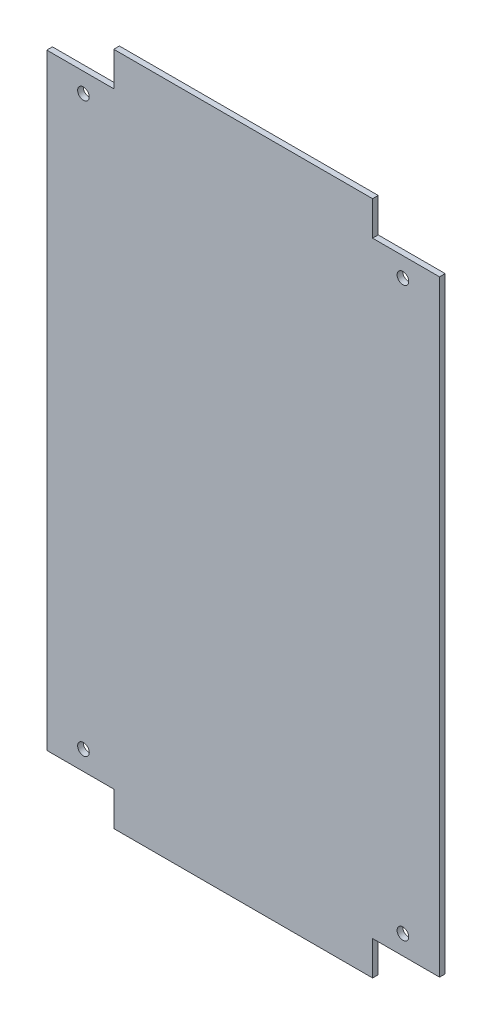
ISO-10303-21;
HEADER;
FILE_DESCRIPTION(('STEP AP214'),'2;1');
FILE_NAME('part.step','',(''),(''),'','','');
FILE_SCHEMA(('AUTOMOTIVE_DESIGN { 1 0 10303 214 1 1 1 1 }'));
ENDSEC;
DATA;
#1=APPLICATION_CONTEXT('core data for automotive mechanical design processes');
#2=APPLICATION_PROTOCOL_DEFINITION('international standard','automotive_design',2000,#1);
#3=PRODUCT_CONTEXT('',#1,'mechanical');
#4=PRODUCT('Part','Part','',(#3));
#5=PRODUCT_RELATED_PRODUCT_CATEGORY('part','',(#4));
#6=PRODUCT_DEFINITION_FORMATION('','',#4);
#7=PRODUCT_DEFINITION_CONTEXT('part definition',#1,'design');
#8=PRODUCT_DEFINITION('design','',#6,#7);
#9=PRODUCT_DEFINITION_SHAPE('','',#8);
#10=(LENGTH_UNIT() NAMED_UNIT(*) SI_UNIT(.MILLI.,.METRE.));
#11=(NAMED_UNIT(*) PLANE_ANGLE_UNIT() SI_UNIT($,.RADIAN.));
#12=(NAMED_UNIT(*) SI_UNIT($,.STERADIAN.) SOLID_ANGLE_UNIT());
#13=UNCERTAINTY_MEASURE_WITH_UNIT(LENGTH_MEASURE(1.E-05),#10,'distance_accuracy_value','');
#14=(GEOMETRIC_REPRESENTATION_CONTEXT(3) GLOBAL_UNCERTAINTY_ASSIGNED_CONTEXT((#13)) GLOBAL_UNIT_ASSIGNED_CONTEXT((#10,
#11,#12)) REPRESENTATION_CONTEXT('',''));
#15=CARTESIAN_POINT('',(0.,0.,0.));
#16=DIRECTION('',(0.,0.,1.));
#17=DIRECTION('',(1.,0.,0.));
#18=AXIS2_PLACEMENT_3D('',#15,#16,#17);
#19=CARTESIAN_POINT('',(5193.57384082783,1631.23707994117,1.6));
#20=DIRECTION('',(1.,0.,0.));
#21=DIRECTION('',(0.,0.,-1.));
#22=AXIS2_PLACEMENT_3D('',#19,#20,#21);
#23=PLANE('',#22);
#24=DIRECTION('',(0.,-1.,0.));
#25=VECTOR('',#24,1.);
#26=CARTESIAN_POINT('',(5193.57384082783,1631.23707994117,0.));
#27=LINE('',#26,#25);
#28=CARTESIAN_POINT('',(5193.57384082783,1803.23707994117,0.));
#29=VERTEX_POINT('',#28);
#30=CARTESIAN_POINT('',(5193.57384082783,1631.23707994117,0.));
#31=VERTEX_POINT('',#30);
#32=EDGE_CURVE('E153',#29,#31,#27,.T.);
#33=ORIENTED_EDGE('',*,*,#32,.T.);
#34=DIRECTION('',(0.,0.,-1.));
#35=VECTOR('',#34,1.);
#36=CARTESIAN_POINT('',(5193.57384082783,1631.23707994117,1.6));
#37=LINE('',#36,#35);
#38=CARTESIAN_POINT('',(5193.57384082783,1631.23707994117,1.6));
#39=VERTEX_POINT('',#38);
#40=EDGE_CURVE('E11',#39,#31,#37,.T.);
#41=ORIENTED_EDGE('',*,*,#40,.F.);
#42=DIRECTION('',(0.,-1.,0.));
#43=VECTOR('',#42,1.);
#44=CARTESIAN_POINT('',(5193.57384082783,1631.23707994117,1.6));
#45=LINE('',#44,#43);
#46=CARTESIAN_POINT('',(5193.57384082783,1803.23707994117,1.6));
#47=VERTEX_POINT('',#46);
#48=EDGE_CURVE('E176',#47,#39,#45,.T.);
#49=ORIENTED_EDGE('',*,*,#48,.F.);
#50=DIRECTION('',(0.,0.,-1.));
#51=VECTOR('',#50,1.);
#52=CARTESIAN_POINT('',(5193.57384082783,1803.23707994117,1.6));
#53=LINE('',#52,#51);
#54=EDGE_CURVE('E149',#47,#29,#53,.T.);
#55=ORIENTED_EDGE('',*,*,#54,.T.);
#56=EDGE_LOOP('',(#33,#41,#49,#55));
#57=FACE_BOUND('',#56,.T.);
#58=ADVANCED_FACE('F33',(#57),#23,.F.);
#59=CARTESIAN_POINT('',(5212.57384082783,1631.23707994117,1.6));
#60=DIRECTION('',(0.,1.,0.));
#61=DIRECTION('',(-1.,0.,0.));
#62=AXIS2_PLACEMENT_3D('',#59,#60,#61);
#63=PLANE('',#62);
#64=DIRECTION('',(1.,0.,0.));
#65=VECTOR('',#64,1.);
#66=CARTESIAN_POINT('',(5212.57384082783,1631.23707994117,0.));
#67=LINE('',#66,#65);
#68=CARTESIAN_POINT('',(5212.57384082783,1631.23707994117,0.));
#69=VERTEX_POINT('',#68);
#70=EDGE_CURVE('E156',#31,#69,#67,.T.);
#71=ORIENTED_EDGE('',*,*,#70,.T.);
#72=DIRECTION('',(0.,0.,-1.));
#73=VECTOR('',#72,1.);
#74=CARTESIAN_POINT('',(5212.57384082783,1631.23707994117,1.6));
#75=LINE('',#74,#73);
#76=CARTESIAN_POINT('',(5212.57384082783,1631.23707994117,1.6));
#77=VERTEX_POINT('',#76);
#78=EDGE_CURVE('E41',#77,#69,#75,.T.);
#79=ORIENTED_EDGE('',*,*,#78,.F.);
#80=DIRECTION('',(1.,0.,0.));
#81=VECTOR('',#80,1.);
#82=CARTESIAN_POINT('',(5212.57384082783,1631.23707994117,1.6));
#83=LINE('',#82,#81);
#84=EDGE_CURVE('E104',#39,#77,#83,.T.);
#85=ORIENTED_EDGE('',*,*,#84,.F.);
#86=ORIENTED_EDGE('',*,*,#40,.T.);
#87=EDGE_LOOP('',(#71,#79,#85,#86));
#88=FACE_BOUND('',#87,.T.);
#89=ADVANCED_FACE('F255',(#88),#63,.F.);
#90=CARTESIAN_POINT('',(5212.57384082783,1621.53707994117,1.6));
#91=DIRECTION('',(1.,0.,0.));
#92=DIRECTION('',(0.,0.,-1.));
#93=AXIS2_PLACEMENT_3D('',#90,#91,#92);
#94=PLANE('',#93);
#95=DIRECTION('',(0.,-1.,0.));
#96=VECTOR('',#95,1.);
#97=CARTESIAN_POINT('',(5212.57384082783,1621.53707994117,0.));
#98=LINE('',#97,#96);
#99=CARTESIAN_POINT('',(5212.57384082783,1621.53707994117,0.));
#100=VERTEX_POINT('',#99);
#101=EDGE_CURVE('E159',#69,#100,#98,.T.);
#102=ORIENTED_EDGE('',*,*,#101,.T.);
#103=DIRECTION('',(0.,0.,-1.));
#104=VECTOR('',#103,1.);
#105=CARTESIAN_POINT('',(5212.57384082783,1621.53707994117,1.6));
#106=LINE('',#105,#104);
#107=CARTESIAN_POINT('',(5212.57384082783,1621.53707994117,1.6));
#108=VERTEX_POINT('',#107);
#109=EDGE_CURVE('E195',#108,#100,#106,.T.);
#110=ORIENTED_EDGE('',*,*,#109,.F.);
#111=DIRECTION('',(0.,-1.,0.));
#112=VECTOR('',#111,1.);
#113=CARTESIAN_POINT('',(5212.57384082783,1621.53707994117,1.6));
#114=LINE('',#113,#112);
#115=EDGE_CURVE('E203',#77,#108,#114,.T.);
#116=ORIENTED_EDGE('',*,*,#115,.F.);
#117=ORIENTED_EDGE('',*,*,#78,.T.);
#118=EDGE_LOOP('',(#102,#110,#116,#117));
#119=FACE_BOUND('',#118,.T.);
#120=ADVANCED_FACE('F201',(#119),#94,.F.);
#121=CARTESIAN_POINT('',(5285.97384082783,1621.53707994117,1.6));
#122=DIRECTION('',(0.,1.,0.));
#123=DIRECTION('',(0.,0.,1.));
#124=AXIS2_PLACEMENT_3D('',#121,#122,#123);
#125=PLANE('',#124);
#126=DIRECTION('',(1.,0.,0.));
#127=VECTOR('',#126,1.);
#128=CARTESIAN_POINT('',(5285.97384082783,1621.53707994117,0.));
#129=LINE('',#128,#127);
#130=CARTESIAN_POINT('',(5285.97384082783,1621.53707994117,0.));
#131=VERTEX_POINT('',#130);
#132=EDGE_CURVE('E161',#100,#131,#129,.T.);
#133=ORIENTED_EDGE('',*,*,#132,.T.);
#134=DIRECTION('',(0.,0.,-1.));
#135=VECTOR('',#134,1.);
#136=CARTESIAN_POINT('',(5285.97384082783,1621.53707994117,1.6));
#137=LINE('',#136,#135);
#138=CARTESIAN_POINT('',(5285.97384082783,1621.53707994117,1.6));
#139=VERTEX_POINT('',#138);
#140=EDGE_CURVE('E192',#139,#131,#137,.T.);
#141=ORIENTED_EDGE('',*,*,#140,.F.);
#142=DIRECTION('',(1.,0.,0.));
#143=VECTOR('',#142,1.);
#144=CARTESIAN_POINT('',(5285.97384082783,1621.53707994117,1.6));
#145=LINE('',#144,#143);
#146=EDGE_CURVE('E221',#108,#139,#145,.T.);
#147=ORIENTED_EDGE('',*,*,#146,.F.);
#148=ORIENTED_EDGE('',*,*,#109,.T.);
#149=EDGE_LOOP('',(#133,#141,#147,#148));
#150=FACE_BOUND('',#149,.T.);
#151=ADVANCED_FACE('F212',(#150),#125,.F.);
#152=CARTESIAN_POINT('',(5285.97384082783,1631.23707994117,1.6));
#153=DIRECTION('',(-1.,0.,0.));
#154=DIRECTION('',(0.,0.,1.));
#155=AXIS2_PLACEMENT_3D('',#152,#153,#154);
#156=PLANE('',#155);
#157=DIRECTION('',(0.,1.,0.));
#158=VECTOR('',#157,1.);
#159=CARTESIAN_POINT('',(5285.97384082783,1631.23707994117,0.));
#160=LINE('',#159,#158);
#161=CARTESIAN_POINT('',(5285.97384082783,1631.23707994117,0.));
#162=VERTEX_POINT('',#161);
#163=EDGE_CURVE('E163',#131,#162,#160,.T.);
#164=ORIENTED_EDGE('',*,*,#163,.T.);
#165=DIRECTION('',(0.,0.,-1.));
#166=VECTOR('',#165,1.);
#167=CARTESIAN_POINT('',(5285.97384082783,1631.23707994117,1.6));
#168=LINE('',#167,#166);
#169=CARTESIAN_POINT('',(5285.97384082783,1631.23707994117,1.6));
#170=VERTEX_POINT('',#169);
#171=EDGE_CURVE('E189',#170,#162,#168,.T.);
#172=ORIENTED_EDGE('',*,*,#171,.F.);
#173=DIRECTION('',(0.,1.,0.));
#174=VECTOR('',#173,1.);
#175=CARTESIAN_POINT('',(5285.97384082783,1631.23707994117,1.6));
#176=LINE('',#175,#174);
#177=EDGE_CURVE('E218',#139,#170,#176,.T.);
#178=ORIENTED_EDGE('',*,*,#177,.F.);
#179=ORIENTED_EDGE('',*,*,#140,.T.);
#180=EDGE_LOOP('',(#164,#172,#178,#179));
#181=FACE_BOUND('',#180,.T.);
#182=ADVANCED_FACE('F216',(#181),#156,.F.);
#183=CARTESIAN_POINT('',(5304.97384082783,1631.23707994117,1.6));
#184=DIRECTION('',(0.,1.,0.));
#185=DIRECTION('',(-1.,0.,0.));
#186=AXIS2_PLACEMENT_3D('',#183,#184,#185);
#187=PLANE('',#186);
#188=DIRECTION('',(1.,0.,0.));
#189=VECTOR('',#188,1.);
#190=CARTESIAN_POINT('',(5304.97384082783,1631.23707994117,0.));
#191=LINE('',#190,#189);
#192=CARTESIAN_POINT('',(5304.97384082783,1631.23707994117,0.));
#193=VERTEX_POINT('',#192);
#194=EDGE_CURVE('E165',#162,#193,#191,.T.);
#195=ORIENTED_EDGE('',*,*,#194,.T.);
#196=DIRECTION('',(0.,0.,-1.));
#197=VECTOR('',#196,1.);
#198=CARTESIAN_POINT('',(5304.97384082783,1631.23707994117,1.6));
#199=LINE('',#198,#197);
#200=CARTESIAN_POINT('',(5304.97384082783,1631.23707994117,1.6));
#201=VERTEX_POINT('',#200);
#202=EDGE_CURVE('E186',#201,#193,#199,.T.);
#203=ORIENTED_EDGE('',*,*,#202,.F.);
#204=DIRECTION('',(1.,0.,0.));
#205=VECTOR('',#204,1.);
#206=CARTESIAN_POINT('',(5304.97384082783,1631.23707994117,1.6));
#207=LINE('',#206,#205);
#208=EDGE_CURVE('E220',#170,#201,#207,.T.);
#209=ORIENTED_EDGE('',*,*,#208,.F.);
#210=ORIENTED_EDGE('',*,*,#171,.T.);
#211=EDGE_LOOP('',(#195,#203,#209,#210));
#212=FACE_BOUND('',#211,.T.);
#213=ADVANCED_FACE('F268',(#212),#187,.F.);
#214=CARTESIAN_POINT('',(5304.97384082783,1803.23707994117,1.6));
#215=DIRECTION('',(-1.,0.,0.));
#216=DIRECTION('',(0.,0.,1.));
#217=AXIS2_PLACEMENT_3D('',#214,#215,#216);
#218=PLANE('',#217);
#219=DIRECTION('',(0.,1.,0.));
#220=VECTOR('',#219,1.);
#221=CARTESIAN_POINT('',(5304.97384082783,1803.23707994117,0.));
#222=LINE('',#221,#220);
#223=CARTESIAN_POINT('',(5304.97384082783,1803.23707994117,0.));
#224=VERTEX_POINT('',#223);
#225=EDGE_CURVE('E167',#193,#224,#222,.T.);
#226=ORIENTED_EDGE('',*,*,#225,.T.);
#227=DIRECTION('',(0.,0.,-1.));
#228=VECTOR('',#227,1.);
#229=CARTESIAN_POINT('',(5304.97384082783,1803.23707994117,1.6));
#230=LINE('',#229,#228);
#231=CARTESIAN_POINT('',(5304.97384082783,1803.23707994117,1.6));
#232=VERTEX_POINT('',#231);
#233=EDGE_CURVE('E183',#232,#224,#230,.T.);
#234=ORIENTED_EDGE('',*,*,#233,.F.);
#235=DIRECTION('',(0.,1.,0.));
#236=VECTOR('',#235,1.);
#237=CARTESIAN_POINT('',(5304.97384082783,1803.23707994117,1.6));
#238=LINE('',#237,#236);
#239=EDGE_CURVE('E223',#201,#232,#238,.T.);
#240=ORIENTED_EDGE('',*,*,#239,.F.);
#241=ORIENTED_EDGE('',*,*,#202,.T.);
#242=EDGE_LOOP('',(#226,#234,#240,#241));
#243=FACE_BOUND('',#242,.T.);
#244=ADVANCED_FACE('F271',(#243),#218,.F.);
#245=CARTESIAN_POINT('',(5285.97384082783,1803.23707994117,1.6));
#246=DIRECTION('',(0.,-1.,0.));
#247=DIRECTION('',(0.,0.,-1.));
#248=AXIS2_PLACEMENT_3D('',#245,#246,#247);
#249=PLANE('',#248);
#250=DIRECTION('',(-1.,0.,0.));
#251=VECTOR('',#250,1.);
#252=CARTESIAN_POINT('',(5285.97384082783,1803.23707994117,0.));
#253=LINE('',#252,#251);
#254=CARTESIAN_POINT('',(5285.97384082783,1803.23707994117,0.));
#255=VERTEX_POINT('',#254);
#256=EDGE_CURVE('E169',#224,#255,#253,.T.);
#257=ORIENTED_EDGE('',*,*,#256,.T.);
#258=DIRECTION('',(0.,0.,-1.));
#259=VECTOR('',#258,1.);
#260=CARTESIAN_POINT('',(5285.97384082783,1803.23707994117,1.6));
#261=LINE('',#260,#259);
#262=CARTESIAN_POINT('',(5285.97384082783,1803.23707994117,1.6));
#263=VERTEX_POINT('',#262);
#264=EDGE_CURVE('E180',#263,#255,#261,.T.);
#265=ORIENTED_EDGE('',*,*,#264,.F.);
#266=DIRECTION('',(-1.,0.,0.));
#267=VECTOR('',#266,1.);
#268=CARTESIAN_POINT('',(5285.97384082783,1803.23707994117,1.6));
#269=LINE('',#268,#267);
#270=EDGE_CURVE('E229',#232,#263,#269,.T.);
#271=ORIENTED_EDGE('',*,*,#270,.F.);
#272=ORIENTED_EDGE('',*,*,#233,.T.);
#273=EDGE_LOOP('',(#257,#265,#271,#272));
#274=FACE_BOUND('',#273,.T.);
#275=ADVANCED_FACE('F235',(#274),#249,.F.);
#276=CARTESIAN_POINT('',(5285.97384082783,1812.93707994117,1.6));
#277=DIRECTION('',(-1.,0.,0.));
#278=DIRECTION('',(0.,0.,1.));
#279=AXIS2_PLACEMENT_3D('',#276,#277,#278);
#280=PLANE('',#279);
#281=DIRECTION('',(0.,1.,0.));
#282=VECTOR('',#281,1.);
#283=CARTESIAN_POINT('',(5285.97384082783,1812.93707994117,0.));
#284=LINE('',#283,#282);
#285=CARTESIAN_POINT('',(5285.97384082783,1812.93707994117,0.));
#286=VERTEX_POINT('',#285);
#287=EDGE_CURVE('E171',#255,#286,#284,.T.);
#288=ORIENTED_EDGE('',*,*,#287,.T.);
#289=DIRECTION('',(0.,0.,-1.));
#290=VECTOR('',#289,1.);
#291=CARTESIAN_POINT('',(5285.97384082783,1812.93707994117,1.6));
#292=LINE('',#291,#290);
#293=CARTESIAN_POINT('',(5285.97384082783,1812.93707994117,1.6));
#294=VERTEX_POINT('',#293);
#295=EDGE_CURVE('E144',#294,#286,#292,.T.);
#296=ORIENTED_EDGE('',*,*,#295,.F.);
#297=DIRECTION('',(0.,1.,0.));
#298=VECTOR('',#297,1.);
#299=CARTESIAN_POINT('',(5285.97384082783,1812.93707994117,1.6));
#300=LINE('',#299,#298);
#301=EDGE_CURVE('E135',#263,#294,#300,.T.);
#302=ORIENTED_EDGE('',*,*,#301,.F.);
#303=ORIENTED_EDGE('',*,*,#264,.T.);
#304=EDGE_LOOP('',(#288,#296,#302,#303));
#305=FACE_BOUND('',#304,.T.);
#306=ADVANCED_FACE('F239',(#305),#280,.F.);
#307=CARTESIAN_POINT('',(5212.57384082783,1812.93707994117,1.6));
#308=DIRECTION('',(0.,-1.,0.));
#309=DIRECTION('',(0.,0.,-1.));
#310=AXIS2_PLACEMENT_3D('',#307,#308,#309);
#311=PLANE('',#310);
#312=DIRECTION('',(-1.,0.,0.));
#313=VECTOR('',#312,1.);
#314=CARTESIAN_POINT('',(5212.57384082783,1812.93707994117,0.));
#315=LINE('',#314,#313);
#316=CARTESIAN_POINT('',(5212.57384082783,1812.93707994117,0.));
#317=VERTEX_POINT('',#316);
#318=EDGE_CURVE('E143',#286,#317,#315,.T.);
#319=ORIENTED_EDGE('',*,*,#318,.T.);
#320=DIRECTION('',(0.,0.,-1.));
#321=VECTOR('',#320,1.);
#322=CARTESIAN_POINT('',(5212.57384082783,1812.93707994117,1.6));
#323=LINE('',#322,#321);
#324=CARTESIAN_POINT('',(5212.57384082783,1812.93707994117,1.6));
#325=VERTEX_POINT('',#324);
#326=EDGE_CURVE('E140',#325,#317,#323,.T.);
#327=ORIENTED_EDGE('',*,*,#326,.F.);
#328=DIRECTION('',(-1.,0.,0.));
#329=VECTOR('',#328,1.);
#330=CARTESIAN_POINT('',(5212.57384082783,1812.93707994117,1.6));
#331=LINE('',#330,#329);
#332=EDGE_CURVE('E129',#294,#325,#331,.T.);
#333=ORIENTED_EDGE('',*,*,#332,.F.);
#334=ORIENTED_EDGE('',*,*,#295,.T.);
#335=EDGE_LOOP('',(#319,#327,#333,#334));
#336=FACE_BOUND('',#335,.T.);
#337=ADVANCED_FACE('F141',(#336),#311,.F.);
#338=CARTESIAN_POINT('',(5212.57384082783,1803.23707994117,1.6));
#339=DIRECTION('',(1.,0.,0.));
#340=DIRECTION('',(0.,0.,-1.));
#341=AXIS2_PLACEMENT_3D('',#338,#339,#340);
#342=PLANE('',#341);
#343=DIRECTION('',(0.,-1.,0.));
#344=VECTOR('',#343,1.);
#345=CARTESIAN_POINT('',(5212.57384082783,1803.23707994117,0.));
#346=LINE('',#345,#344);
#347=CARTESIAN_POINT('',(5212.57384082783,1803.23707994117,0.));
#348=VERTEX_POINT('',#347);
#349=EDGE_CURVE('E90',#317,#348,#346,.T.);
#350=ORIENTED_EDGE('',*,*,#349,.T.);
#351=DIRECTION('',(0.,0.,-1.));
#352=VECTOR('',#351,1.);
#353=CARTESIAN_POINT('',(5212.57384082783,1803.23707994117,1.6));
#354=LINE('',#353,#352);
#355=CARTESIAN_POINT('',(5212.57384082783,1803.23707994117,1.6));
#356=VERTEX_POINT('',#355);
#357=EDGE_CURVE('E145',#356,#348,#354,.T.);
#358=ORIENTED_EDGE('',*,*,#357,.F.);
#359=DIRECTION('',(0.,-1.,0.));
#360=VECTOR('',#359,1.);
#361=CARTESIAN_POINT('',(5212.57384082783,1803.23707994117,1.6));
#362=LINE('',#361,#360);
#363=EDGE_CURVE('E133',#325,#356,#362,.T.);
#364=ORIENTED_EDGE('',*,*,#363,.F.);
#365=ORIENTED_EDGE('',*,*,#326,.T.);
#366=EDGE_LOOP('',(#350,#358,#364,#365));
#367=FACE_BOUND('',#366,.T.);
#368=ADVANCED_FACE('F147',(#367),#342,.F.);
#369=CARTESIAN_POINT('',(5193.57384082783,1803.23707994117,1.6));
#370=DIRECTION('',(0.,-1.,0.));
#371=DIRECTION('',(0.,0.,-1.));
#372=AXIS2_PLACEMENT_3D('',#369,#370,#371);
#373=PLANE('',#372);
#374=DIRECTION('',(-1.,0.,0.));
#375=VECTOR('',#374,1.);
#376=CARTESIAN_POINT('',(5193.57384082783,1803.23707994117,0.));
#377=LINE('',#376,#375);
#378=EDGE_CURVE('E96',#348,#29,#377,.T.);
#379=ORIENTED_EDGE('',*,*,#378,.T.);
#380=ORIENTED_EDGE('',*,*,#54,.F.);
#381=DIRECTION('',(-1.,0.,0.));
#382=VECTOR('',#381,1.);
#383=CARTESIAN_POINT('',(5193.57384082783,1803.23707994117,1.6));
#384=LINE('',#383,#382);
#385=EDGE_CURVE('E49',#356,#47,#384,.T.);
#386=ORIENTED_EDGE('',*,*,#385,.F.);
#387=ORIENTED_EDGE('',*,*,#357,.T.);
#388=EDGE_LOOP('',(#379,#380,#386,#387));
#389=FACE_BOUND('',#388,.T.);
#390=ADVANCED_FACE('F243',(#389),#373,.F.);
#391=CARTESIAN_POINT('',(0.,0.,1.6));
#392=DIRECTION('',(0.,0.,-1.));
#393=DIRECTION('',(-1.,0.,0.));
#394=AXIS2_PLACEMENT_3D('',#391,#392,#393);
#395=PLANE('',#394);
#396=CARTESIAN_POINT('',(5203.97384082783,1636.73692877193,1.6));
#397=DIRECTION('',(0.,0.,1.));
#398=DIRECTION('',(1.,0.,0.));
#399=AXIS2_PLACEMENT_3D('',#396,#397,#398);
#400=CIRCLE('',#399,1.6500000000006);
#401=CARTESIAN_POINT('',(5205.62384082783,1636.73692877193,1.6));
#402=VERTEX_POINT('',#401);
#403=EDGE_CURVE('E360',#402,#402,#400,.T.);
#404=ORIENTED_EDGE('',*,*,#403,.F.);
#405=EDGE_LOOP('',(#404));
#406=FACE_BOUND('',#405,.T.);
#407=CARTESIAN_POINT('',(5294.57384082783,1636.73692877193,1.6));
#408=DIRECTION('',(0.,0.,1.));
#409=DIRECTION('',(1.,0.,0.));
#410=AXIS2_PLACEMENT_3D('',#407,#408,#409);
#411=CIRCLE('',#410,1.64999999999971);
#412=CARTESIAN_POINT('',(5296.22384082783,1636.73692877193,1.6));
#413=VERTEX_POINT('',#412);
#414=EDGE_CURVE('E364',#413,#413,#411,.T.);
#415=ORIENTED_EDGE('',*,*,#414,.F.);
#416=EDGE_LOOP('',(#415));
#417=FACE_BOUND('',#416,.T.);
#418=CARTESIAN_POINT('',(5294.57384082783,1797.73692877193,1.6));
#419=DIRECTION('',(0.,0.,1.));
#420=DIRECTION('',(1.,0.,0.));
#421=AXIS2_PLACEMENT_3D('',#418,#419,#420);
#422=CIRCLE('',#421,1.64999999999971);
#423=CARTESIAN_POINT('',(5296.22384082783,1797.73692877193,1.6));
#424=VERTEX_POINT('',#423);
#425=EDGE_CURVE('E381',#424,#424,#422,.T.);
#426=ORIENTED_EDGE('',*,*,#425,.F.);
#427=EDGE_LOOP('',(#426));
#428=FACE_BOUND('',#427,.T.);
#429=CARTESIAN_POINT('',(5203.97384082783,1797.73692877193,1.6));
#430=DIRECTION('',(0.,0.,1.));
#431=DIRECTION('',(1.,0.,0.));
#432=AXIS2_PLACEMENT_3D('',#429,#430,#431);
#433=CIRCLE('',#432,1.6500000000006);
#434=CARTESIAN_POINT('',(5205.62384082783,1797.73692877193,1.6));
#435=VERTEX_POINT('',#434);
#436=EDGE_CURVE('E374',#435,#435,#433,.T.);
#437=ORIENTED_EDGE('',*,*,#436,.F.);
#438=EDGE_LOOP('',(#437));
#439=FACE_BOUND('',#438,.T.);
#440=ORIENTED_EDGE('',*,*,#48,.T.);
#441=ORIENTED_EDGE('',*,*,#84,.T.);
#442=ORIENTED_EDGE('',*,*,#115,.T.);
#443=ORIENTED_EDGE('',*,*,#146,.T.);
#444=ORIENTED_EDGE('',*,*,#177,.T.);
#445=ORIENTED_EDGE('',*,*,#208,.T.);
#446=ORIENTED_EDGE('',*,*,#239,.T.);
#447=ORIENTED_EDGE('',*,*,#270,.T.);
#448=ORIENTED_EDGE('',*,*,#301,.T.);
#449=ORIENTED_EDGE('',*,*,#332,.T.);
#450=ORIENTED_EDGE('',*,*,#363,.T.);
#451=ORIENTED_EDGE('',*,*,#385,.T.);
#452=EDGE_LOOP('',(#440,#441,#442,#443,#444,#445,#446,#447,#448,#449,#450,#451));
#453=FACE_BOUND('',#452,.T.);
#454=ADVANCED_FACE('F131',(#406,#417,#428,#439,#453),#395,.F.);
#455=CARTESIAN_POINT('',(0.,0.,0.));
#456=DIRECTION('',(0.,0.,-1.));
#457=DIRECTION('',(-1.,0.,0.));
#458=AXIS2_PLACEMENT_3D('',#455,#456,#457);
#459=PLANE('',#458);
#460=CARTESIAN_POINT('',(5203.97384082783,1636.73692877193,0.));
#461=DIRECTION('',(0.,0.,1.));
#462=DIRECTION('',(1.,0.,0.));
#463=AXIS2_PLACEMENT_3D('',#460,#461,#462);
#464=CIRCLE('',#463,1.6500000000006);
#465=CARTESIAN_POINT('',(5205.62384082783,1636.73692877193,0.));
#466=VERTEX_POINT('',#465);
#467=EDGE_CURVE('E363',#466,#466,#464,.T.);
#468=ORIENTED_EDGE('',*,*,#467,.T.);
#469=EDGE_LOOP('',(#468));
#470=FACE_BOUND('',#469,.T.);
#471=CARTESIAN_POINT('',(5294.57384082783,1636.73692877193,0.));
#472=DIRECTION('',(0.,0.,1.));
#473=DIRECTION('',(1.,0.,0.));
#474=AXIS2_PLACEMENT_3D('',#471,#472,#473);
#475=CIRCLE('',#474,1.64999999999971);
#476=CARTESIAN_POINT('',(5296.22384082783,1636.73692877193,0.));
#477=VERTEX_POINT('',#476);
#478=EDGE_CURVE('E367',#477,#477,#475,.T.);
#479=ORIENTED_EDGE('',*,*,#478,.T.);
#480=EDGE_LOOP('',(#479));
#481=FACE_BOUND('',#480,.T.);
#482=CARTESIAN_POINT('',(5294.57384082783,1797.73692877193,0.));
#483=DIRECTION('',(0.,0.,1.));
#484=DIRECTION('',(1.,0.,0.));
#485=AXIS2_PLACEMENT_3D('',#482,#483,#484);
#486=CIRCLE('',#485,1.64999999999971);
#487=CARTESIAN_POINT('',(5296.22384082783,1797.73692877193,0.));
#488=VERTEX_POINT('',#487);
#489=EDGE_CURVE('E377',#488,#488,#486,.T.);
#490=ORIENTED_EDGE('',*,*,#489,.T.);
#491=EDGE_LOOP('',(#490));
#492=FACE_BOUND('',#491,.T.);
#493=CARTESIAN_POINT('',(5203.97384082783,1797.73692877193,0.));
#494=DIRECTION('',(0.,0.,1.));
#495=DIRECTION('',(1.,0.,0.));
#496=AXIS2_PLACEMENT_3D('',#493,#494,#495);
#497=CIRCLE('',#496,1.6500000000006);
#498=CARTESIAN_POINT('',(5205.62384082783,1797.73692877193,0.));
#499=VERTEX_POINT('',#498);
#500=EDGE_CURVE('E157',#499,#499,#497,.T.);
#501=ORIENTED_EDGE('',*,*,#500,.T.);
#502=EDGE_LOOP('',(#501));
#503=FACE_BOUND('',#502,.T.);
#504=ORIENTED_EDGE('',*,*,#32,.F.);
#505=ORIENTED_EDGE('',*,*,#378,.F.);
#506=ORIENTED_EDGE('',*,*,#349,.F.);
#507=ORIENTED_EDGE('',*,*,#318,.F.);
#508=ORIENTED_EDGE('',*,*,#287,.F.);
#509=ORIENTED_EDGE('',*,*,#256,.F.);
#510=ORIENTED_EDGE('',*,*,#225,.F.);
#511=ORIENTED_EDGE('',*,*,#194,.F.);
#512=ORIENTED_EDGE('',*,*,#163,.F.);
#513=ORIENTED_EDGE('',*,*,#132,.F.);
#514=ORIENTED_EDGE('',*,*,#101,.F.);
#515=ORIENTED_EDGE('',*,*,#70,.F.);
#516=EDGE_LOOP('',(#504,#505,#506,#507,#508,#509,#510,#511,#512,#513,#514,#515));
#517=FACE_BOUND('',#516,.T.);
#518=ADVANCED_FACE('F207',(#470,#481,#492,#503,#517),#459,.T.);
#519=CARTESIAN_POINT('',(5203.97384082783,1797.73692877193,0.));
#520=DIRECTION('',(0.,0.,1.));
#521=DIRECTION('',(1.,0.,0.));
#522=AXIS2_PLACEMENT_3D('',#519,#520,#521);
#523=CYLINDRICAL_SURFACE('',#522,1.6500000000006);
#524=ORIENTED_EDGE('',*,*,#436,.T.);
#525=EDGE_LOOP('',(#524));
#526=FACE_BOUND('',#525,.T.);
#527=ORIENTED_EDGE('',*,*,#500,.F.);
#528=EDGE_LOOP('',(#527));
#529=FACE_BOUND('',#528,.T.);
#530=ADVANCED_FACE('F308',(#526,#529),#523,.F.);
#531=CARTESIAN_POINT('',(5294.57384082783,1797.73692877193,0.));
#532=DIRECTION('',(0.,0.,1.));
#533=DIRECTION('',(1.,0.,0.));
#534=AXIS2_PLACEMENT_3D('',#531,#532,#533);
#535=CYLINDRICAL_SURFACE('',#534,1.64999999999971);
#536=ORIENTED_EDGE('',*,*,#425,.T.);
#537=EDGE_LOOP('',(#536));
#538=FACE_BOUND('',#537,.T.);
#539=ORIENTED_EDGE('',*,*,#489,.F.);
#540=EDGE_LOOP('',(#539));
#541=FACE_BOUND('',#540,.T.);
#542=ADVANCED_FACE('F318',(#538,#541),#535,.F.);
#543=CARTESIAN_POINT('',(5294.57384082783,1636.73692877193,0.));
#544=DIRECTION('',(0.,0.,1.));
#545=DIRECTION('',(1.,0.,0.));
#546=AXIS2_PLACEMENT_3D('',#543,#544,#545);
#547=CYLINDRICAL_SURFACE('',#546,1.64999999999971);
#548=ORIENTED_EDGE('',*,*,#414,.T.);
#549=EDGE_LOOP('',(#548));
#550=FACE_BOUND('',#549,.T.);
#551=ORIENTED_EDGE('',*,*,#478,.F.);
#552=EDGE_LOOP('',(#551));
#553=FACE_BOUND('',#552,.T.);
#554=ADVANCED_FACE('F329',(#550,#553),#547,.F.);
#555=CARTESIAN_POINT('',(5203.97384082783,1636.73692877193,0.));
#556=DIRECTION('',(0.,0.,1.));
#557=DIRECTION('',(1.,0.,0.));
#558=AXIS2_PLACEMENT_3D('',#555,#556,#557);
#559=CYLINDRICAL_SURFACE('',#558,1.6500000000006);
#560=ORIENTED_EDGE('',*,*,#403,.T.);
#561=EDGE_LOOP('',(#560));
#562=FACE_BOUND('',#561,.T.);
#563=ORIENTED_EDGE('',*,*,#467,.F.);
#564=EDGE_LOOP('',(#563));
#565=FACE_BOUND('',#564,.T.);
#566=ADVANCED_FACE('F340',(#562,#565),#559,.F.);
#567=CLOSED_SHELL('',(#58,#89,#120,#151,#182,#213,#244,#275,#306,#337,#368,#390,#454,#518,#530,
#542,#554,#566));
#568=MANIFOLD_SOLID_BREP('B2',#567);
#569=ADVANCED_BREP_SHAPE_REPRESENTATION('',(#18,#568),#14);
#570=SHAPE_DEFINITION_REPRESENTATION(#9,#569);
ENDSEC;
END-ISO-10303-21;
